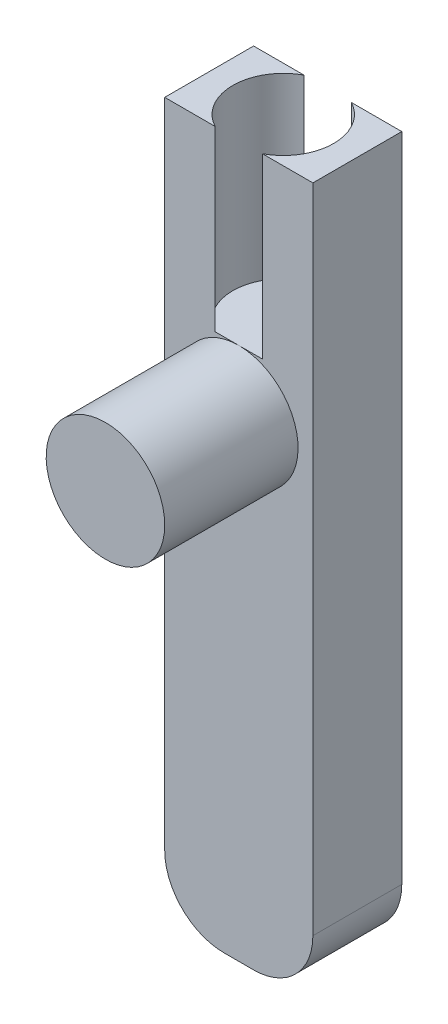
ISO-10303-21;
HEADER;
FILE_DESCRIPTION(('STEP AP214'),'2;1');
FILE_NAME('part.step','',(''),(''),'','','');
FILE_SCHEMA(('AUTOMOTIVE_DESIGN { 1 0 10303 214 1 1 1 1 }'));
ENDSEC;
DATA;
#1=APPLICATION_CONTEXT('core data for automotive mechanical design processes');
#2=APPLICATION_PROTOCOL_DEFINITION('international standard','automotive_design',2000,#1);
#3=PRODUCT_CONTEXT('',#1,'mechanical');
#4=PRODUCT('Part','Part','',(#3));
#5=PRODUCT_RELATED_PRODUCT_CATEGORY('part','',(#4));
#6=PRODUCT_DEFINITION_FORMATION('','',#4);
#7=PRODUCT_DEFINITION_CONTEXT('part definition',#1,'design');
#8=PRODUCT_DEFINITION('design','',#6,#7);
#9=PRODUCT_DEFINITION_SHAPE('','',#8);
#10=(LENGTH_UNIT() NAMED_UNIT(*) SI_UNIT(.MILLI.,.METRE.));
#11=(NAMED_UNIT(*) PLANE_ANGLE_UNIT() SI_UNIT($,.RADIAN.));
#12=(NAMED_UNIT(*) SI_UNIT($,.STERADIAN.) SOLID_ANGLE_UNIT());
#13=UNCERTAINTY_MEASURE_WITH_UNIT(LENGTH_MEASURE(1.E-05),#10,'distance_accuracy_value','');
#14=(GEOMETRIC_REPRESENTATION_CONTEXT(3) GLOBAL_UNCERTAINTY_ASSIGNED_CONTEXT((#13)) GLOBAL_UNIT_ASSIGNED_CONTEXT((#10,
#11,#12)) REPRESENTATION_CONTEXT('',''));
#15=CARTESIAN_POINT('',(0.,0.,0.));
#16=DIRECTION('',(0.,0.,1.));
#17=DIRECTION('',(1.,0.,0.));
#18=AXIS2_PLACEMENT_3D('',#15,#16,#17);
#19=CARTESIAN_POINT('',(0.,12.,1.5));
#20=DIRECTION('',(0.,-1.,0.));
#21=DIRECTION('',(0.,0.,-1.));
#22=AXIS2_PLACEMENT_3D('',#19,#20,#21);
#23=PLANE('',#22);
#24=DIRECTION('',(-1.,0.,0.));
#25=VECTOR('',#24,1.);
#26=CARTESIAN_POINT('',(0.,12.,0.));
#27=LINE('',#26,#25);
#28=CARTESIAN_POINT('',(0.,12.,0.));
#29=VERTEX_POINT('',#28);
#30=CARTESIAN_POINT('',(-0.85,12.,0.));
#31=VERTEX_POINT('',#30);
#32=EDGE_CURVE('E147',#29,#31,#27,.T.);
#33=ORIENTED_EDGE('',*,*,#32,.T.);
#34=CARTESIAN_POINT('',(-1.25,12.,0.75));
#35=DIRECTION('',(0.,1.,0.));
#36=DIRECTION('',(0.,0.,1.));
#37=AXIS2_PLACEMENT_3D('',#34,#35,#36);
#38=CIRCLE('',#37,0.85);
#39=CARTESIAN_POINT('',(-0.85,12.,1.5));
#40=VERTEX_POINT('',#39);
#41=EDGE_CURVE('E168',#40,#31,#38,.T.);
#42=ORIENTED_EDGE('',*,*,#41,.F.);
#43=DIRECTION('',(-1.,0.,0.));
#44=VECTOR('',#43,1.);
#45=CARTESIAN_POINT('',(0.,12.,1.5));
#46=LINE('',#45,#44);
#47=CARTESIAN_POINT('',(0.,12.,1.5));
#48=VERTEX_POINT('',#47);
#49=EDGE_CURVE('E131',#48,#40,#46,.T.);
#50=ORIENTED_EDGE('',*,*,#49,.F.);
#51=DIRECTION('',(0.,0.,-1.));
#52=VECTOR('',#51,1.);
#53=CARTESIAN_POINT('',(0.,12.,1.5));
#54=LINE('',#53,#52);
#55=EDGE_CURVE('E125',#48,#29,#54,.T.);
#56=ORIENTED_EDGE('',*,*,#55,.T.);
#57=EDGE_LOOP('',(#33,#42,#50,#56));
#58=FACE_BOUND('',#57,.T.);
#59=ADVANCED_FACE('F34',(#58),#23,.F.);
#60=CARTESIAN_POINT('',(-2.5,1.00000000000001,1.5));
#61=DIRECTION('',(1.,0.,0.));
#62=DIRECTION('',(0.,1.,0.));
#63=AXIS2_PLACEMENT_3D('',#60,#61,#62);
#64=PLANE('',#63);
#65=DIRECTION('',(0.,-1.,0.));
#66=VECTOR('',#65,1.);
#67=CARTESIAN_POINT('',(-2.5,1.00000000000001,0.));
#68=LINE('',#67,#66);
#69=CARTESIAN_POINT('',(-2.5,12.,0.));
#70=VERTEX_POINT('',#69);
#71=CARTESIAN_POINT('',(-2.5,1.,0.));
#72=VERTEX_POINT('',#71);
#73=EDGE_CURVE('E136',#70,#72,#68,.T.);
#74=ORIENTED_EDGE('',*,*,#73,.T.);
#75=DIRECTION('',(0.,0.,-1.));
#76=VECTOR('',#75,1.);
#77=CARTESIAN_POINT('',(-2.5,1.,1.5));
#78=LINE('',#77,#76);
#79=CARTESIAN_POINT('',(-2.5,1.,1.5));
#80=VERTEX_POINT('',#79);
#81=EDGE_CURVE('E11',#80,#72,#78,.T.);
#82=ORIENTED_EDGE('',*,*,#81,.F.);
#83=DIRECTION('',(0.,-1.,0.));
#84=VECTOR('',#83,1.);
#85=CARTESIAN_POINT('',(-2.5,1.00000000000001,1.5));
#86=LINE('',#85,#84);
#87=CARTESIAN_POINT('',(-2.5,12.,1.5));
#88=VERTEX_POINT('',#87);
#89=EDGE_CURVE('E150',#88,#80,#86,.T.);
#90=ORIENTED_EDGE('',*,*,#89,.F.);
#91=DIRECTION('',(0.,0.,-1.));
#92=VECTOR('',#91,1.);
#93=CARTESIAN_POINT('',(-2.5,12.,1.5));
#94=LINE('',#93,#92);
#95=EDGE_CURVE('E135',#88,#70,#94,.T.);
#96=ORIENTED_EDGE('',*,*,#95,.T.);
#97=EDGE_LOOP('',(#74,#82,#90,#96));
#98=FACE_BOUND('',#97,.T.);
#99=ADVANCED_FACE('F36',(#98),#64,.F.);
#100=CARTESIAN_POINT('',(-1.5,1.,1.5));
#101=DIRECTION('',(0.,0.,-1.));
#102=DIRECTION('',(-1.,0.,0.));
#103=AXIS2_PLACEMENT_3D('',#100,#101,#102);
#104=CYLINDRICAL_SURFACE('',#103,1.);
#105=CARTESIAN_POINT('',(-1.5,1.,0.));
#106=DIRECTION('',(0.,0.,1.));
#107=DIRECTION('',(-1.,0.,0.));
#108=AXIS2_PLACEMENT_3D('',#105,#106,#107);
#109=CIRCLE('',#108,1.);
#110=CARTESIAN_POINT('',(-1.49999999999999,0.,0.));
#111=VERTEX_POINT('',#110);
#112=EDGE_CURVE('E139',#72,#111,#109,.T.);
#113=ORIENTED_EDGE('',*,*,#112,.T.);
#114=DIRECTION('',(0.,0.,-1.));
#115=VECTOR('',#114,1.);
#116=CARTESIAN_POINT('',(-1.49999999999999,0.,1.5));
#117=LINE('',#116,#115);
#118=CARTESIAN_POINT('',(-1.49999999999999,0.,1.5));
#119=VERTEX_POINT('',#118);
#120=EDGE_CURVE('E42',#119,#111,#117,.T.);
#121=ORIENTED_EDGE('',*,*,#120,.F.);
#122=CARTESIAN_POINT('',(-1.5,1.,1.5));
#123=DIRECTION('',(0.,0.,1.));
#124=DIRECTION('',(-1.,0.,0.));
#125=AXIS2_PLACEMENT_3D('',#122,#123,#124);
#126=CIRCLE('',#125,1.);
#127=EDGE_CURVE('E94',#80,#119,#126,.T.);
#128=ORIENTED_EDGE('',*,*,#127,.F.);
#129=ORIENTED_EDGE('',*,*,#81,.T.);
#130=EDGE_LOOP('',(#113,#121,#128,#129));
#131=FACE_BOUND('',#130,.T.);
#132=ADVANCED_FACE('F243',(#131),#104,.T.);
#133=CARTESIAN_POINT('',(-1.00000000000001,0.,1.5));
#134=DIRECTION('',(0.,1.,0.));
#135=DIRECTION('',(-1.,0.,0.));
#136=AXIS2_PLACEMENT_3D('',#133,#134,#135);
#137=PLANE('',#136);
#138=DIRECTION('',(1.,0.,0.));
#139=VECTOR('',#138,1.);
#140=CARTESIAN_POINT('',(-1.00000000000001,0.,0.));
#141=LINE('',#140,#139);
#142=CARTESIAN_POINT('',(-1.00000000000001,0.,0.));
#143=VERTEX_POINT('',#142);
#144=EDGE_CURVE('E142',#111,#143,#141,.T.);
#145=ORIENTED_EDGE('',*,*,#144,.T.);
#146=DIRECTION('',(0.,0.,-1.));
#147=VECTOR('',#146,1.);
#148=CARTESIAN_POINT('',(-1.00000000000001,0.,1.5));
#149=LINE('',#148,#147);
#150=CARTESIAN_POINT('',(-1.00000000000001,0.,1.5));
#151=VERTEX_POINT('',#150);
#152=EDGE_CURVE('E124',#151,#143,#149,.T.);
#153=ORIENTED_EDGE('',*,*,#152,.F.);
#154=DIRECTION('',(1.,0.,0.));
#155=VECTOR('',#154,1.);
#156=CARTESIAN_POINT('',(-1.00000000000001,0.,1.5));
#157=LINE('',#156,#155);
#158=EDGE_CURVE('E112',#119,#151,#157,.T.);
#159=ORIENTED_EDGE('',*,*,#158,.F.);
#160=ORIENTED_EDGE('',*,*,#120,.T.);
#161=EDGE_LOOP('',(#145,#153,#159,#160));
#162=FACE_BOUND('',#161,.T.);
#163=ADVANCED_FACE('F156',(#162),#137,.F.);
#164=CARTESIAN_POINT('',(-1.,1.,1.5));
#165=DIRECTION('',(0.,0.,-1.));
#166=DIRECTION('',(-1.,0.,0.));
#167=AXIS2_PLACEMENT_3D('',#164,#165,#166);
#168=CYLINDRICAL_SURFACE('',#167,1.);
#169=CARTESIAN_POINT('',(-1.,1.,0.));
#170=DIRECTION('',(0.,0.,1.));
#171=DIRECTION('',(1.,0.,0.));
#172=AXIS2_PLACEMENT_3D('',#169,#170,#171);
#173=CIRCLE('',#172,1.);
#174=CARTESIAN_POINT('',(0.,1.00000000000001,0.));
#175=VERTEX_POINT('',#174);
#176=EDGE_CURVE('E121',#143,#175,#173,.T.);
#177=ORIENTED_EDGE('',*,*,#176,.T.);
#178=DIRECTION('',(0.,0.,-1.));
#179=VECTOR('',#178,1.);
#180=CARTESIAN_POINT('',(0.,1.00000000000001,1.5));
#181=LINE('',#180,#179);
#182=CARTESIAN_POINT('',(0.,1.00000000000001,1.5));
#183=VERTEX_POINT('',#182);
#184=EDGE_CURVE('E118',#183,#175,#181,.T.);
#185=ORIENTED_EDGE('',*,*,#184,.F.);
#186=CARTESIAN_POINT('',(-1.,1.,1.5));
#187=DIRECTION('',(0.,0.,1.));
#188=DIRECTION('',(1.,0.,0.));
#189=AXIS2_PLACEMENT_3D('',#186,#187,#188);
#190=CIRCLE('',#189,1.);
#191=EDGE_CURVE('E103',#151,#183,#190,.T.);
#192=ORIENTED_EDGE('',*,*,#191,.F.);
#193=ORIENTED_EDGE('',*,*,#152,.T.);
#194=EDGE_LOOP('',(#177,#185,#192,#193));
#195=FACE_BOUND('',#194,.T.);
#196=ADVANCED_FACE('F119',(#195),#168,.T.);
#197=CARTESIAN_POINT('',(0.,1.00000000000001,1.5));
#198=DIRECTION('',(-1.,0.,0.));
#199=DIRECTION('',(0.,0.,1.));
#200=AXIS2_PLACEMENT_3D('',#197,#198,#199);
#201=PLANE('',#200);
#202=DIRECTION('',(0.,1.,0.));
#203=VECTOR('',#202,1.);
#204=CARTESIAN_POINT('',(0.,1.00000000000001,0.));
#205=LINE('',#204,#203);
#206=EDGE_CURVE('E145',#175,#29,#205,.T.);
#207=ORIENTED_EDGE('',*,*,#206,.T.);
#208=ORIENTED_EDGE('',*,*,#55,.F.);
#209=DIRECTION('',(0.,1.,0.));
#210=VECTOR('',#209,1.);
#211=CARTESIAN_POINT('',(0.,1.00000000000001,1.5));
#212=LINE('',#211,#210);
#213=EDGE_CURVE('E109',#183,#48,#212,.T.);
#214=ORIENTED_EDGE('',*,*,#213,.F.);
#215=ORIENTED_EDGE('',*,*,#184,.T.);
#216=EDGE_LOOP('',(#207,#208,#214,#215));
#217=FACE_BOUND('',#216,.T.);
#218=ADVANCED_FACE('F127',(#217),#201,.F.);
#219=CARTESIAN_POINT('',(-1.65,12.,1.5));
#220=VERTEX_POINT('',#219);
#221=EDGE_CURVE('E58',#220,#88,#46,.T.);
#222=ORIENTED_EDGE('',*,*,#221,.F.);
#223=CARTESIAN_POINT('',(-1.65,12.,0.));
#224=VERTEX_POINT('',#223);
#225=EDGE_CURVE('E189',#224,#220,#38,.T.);
#226=ORIENTED_EDGE('',*,*,#225,.F.);
#227=EDGE_CURVE('E86',#224,#70,#27,.T.);
#228=ORIENTED_EDGE('',*,*,#227,.T.);
#229=ORIENTED_EDGE('',*,*,#95,.F.);
#230=EDGE_LOOP('',(#222,#226,#228,#229));
#231=FACE_BOUND('',#230,.T.);
#232=ADVANCED_FACE('F199',(#231),#23,.F.);
#233=CARTESIAN_POINT('',(-1.,1.,1.5));
#234=DIRECTION('',(0.,0.,1.));
#235=DIRECTION('',(1.,0.,0.));
#236=AXIS2_PLACEMENT_3D('',#233,#234,#235);
#237=PLANE('',#236);
#238=DIRECTION('',(0.,1.,0.));
#239=VECTOR('',#238,1.);
#240=CARTESIAN_POINT('',(-0.85,9.,1.5));
#241=LINE('',#240,#239);
#242=CARTESIAN_POINT('',(-0.85,9.,1.5));
#243=VERTEX_POINT('',#242);
#244=EDGE_CURVE('E172',#243,#40,#241,.T.);
#245=ORIENTED_EDGE('',*,*,#244,.F.);
#246=DIRECTION('',(-1.,0.,0.));
#247=VECTOR('',#246,1.);
#248=CARTESIAN_POINT('',(-1.,9.,1.5));
#249=LINE('',#248,#247);
#250=CARTESIAN_POINT('',(-1.25,9.,1.5));
#251=VERTEX_POINT('',#250);
#252=EDGE_CURVE('E214',#243,#251,#249,.T.);
#253=ORIENTED_EDGE('',*,*,#252,.T.);
#254=CARTESIAN_POINT('',(-1.25,8.,1.5));
#255=DIRECTION('',(0.,0.,1.));
#256=DIRECTION('',(1.,0.,0.));
#257=AXIS2_PLACEMENT_3D('',#254,#255,#256);
#258=CIRCLE('',#257,1.);
#259=EDGE_CURVE('E206',#251,#251,#258,.T.);
#260=ORIENTED_EDGE('',*,*,#259,.F.);
#261=CARTESIAN_POINT('',(-1.65,9.,1.5));
#262=VERTEX_POINT('',#261);
#263=EDGE_CURVE('E196',#251,#262,#249,.T.);
#264=ORIENTED_EDGE('',*,*,#263,.T.);
#265=DIRECTION('',(0.,1.,0.));
#266=VECTOR('',#265,1.);
#267=CARTESIAN_POINT('',(-1.65,9.,1.5));
#268=LINE('',#267,#266);
#269=EDGE_CURVE('E191',#220,#262,#268,.F.);
#270=ORIENTED_EDGE('',*,*,#269,.F.);
#271=ORIENTED_EDGE('',*,*,#221,.T.);
#272=ORIENTED_EDGE('',*,*,#89,.T.);
#273=ORIENTED_EDGE('',*,*,#127,.T.);
#274=ORIENTED_EDGE('',*,*,#158,.T.);
#275=ORIENTED_EDGE('',*,*,#191,.T.);
#276=ORIENTED_EDGE('',*,*,#213,.T.);
#277=ORIENTED_EDGE('',*,*,#49,.T.);
#278=EDGE_LOOP('',(#245,#253,#260,#264,#270,#271,#272,#273,#274,#275,#276,#277));
#279=FACE_BOUND('',#278,.T.);
#280=ADVANCED_FACE('F106',(#279),#237,.T.);
#281=CARTESIAN_POINT('',(-1.,1.,0.));
#282=DIRECTION('',(0.,0.,1.));
#283=DIRECTION('',(1.,0.,0.));
#284=AXIS2_PLACEMENT_3D('',#281,#282,#283);
#285=PLANE('',#284);
#286=DIRECTION('',(-1.,0.,0.));
#287=VECTOR('',#286,1.);
#288=CARTESIAN_POINT('',(-1.,9.,0.));
#289=LINE('',#288,#287);
#290=CARTESIAN_POINT('',(-0.85,9.,0.));
#291=VERTEX_POINT('',#290);
#292=CARTESIAN_POINT('',(-1.65,9.,0.));
#293=VERTEX_POINT('',#292);
#294=EDGE_CURVE('E215',#291,#293,#289,.T.);
#295=ORIENTED_EDGE('',*,*,#294,.F.);
#296=DIRECTION('',(0.,1.,0.));
#297=VECTOR('',#296,1.);
#298=CARTESIAN_POINT('',(-0.85,9.,0.));
#299=LINE('',#298,#297);
#300=EDGE_CURVE('E197',#291,#31,#299,.T.);
#301=ORIENTED_EDGE('',*,*,#300,.T.);
#302=ORIENTED_EDGE('',*,*,#32,.F.);
#303=ORIENTED_EDGE('',*,*,#206,.F.);
#304=ORIENTED_EDGE('',*,*,#176,.F.);
#305=ORIENTED_EDGE('',*,*,#144,.F.);
#306=ORIENTED_EDGE('',*,*,#112,.F.);
#307=ORIENTED_EDGE('',*,*,#73,.F.);
#308=ORIENTED_EDGE('',*,*,#227,.F.);
#309=DIRECTION('',(0.,1.,0.));
#310=VECTOR('',#309,1.);
#311=CARTESIAN_POINT('',(-1.65,9.,0.));
#312=LINE('',#311,#310);
#313=EDGE_CURVE('E187',#224,#293,#312,.F.);
#314=ORIENTED_EDGE('',*,*,#313,.T.);
#315=EDGE_LOOP('',(#295,#301,#302,#303,#304,#305,#306,#307,#308,#314));
#316=FACE_BOUND('',#315,.T.);
#317=ADVANCED_FACE('F159',(#316),#285,.F.);
#318=CARTESIAN_POINT('',(-1.25,8.,3.75));
#319=DIRECTION('',(0.,0.,-1.));
#320=DIRECTION('',(-1.,0.,0.));
#321=AXIS2_PLACEMENT_3D('',#318,#319,#320);
#322=CYLINDRICAL_SURFACE('',#321,1.);
#323=ORIENTED_EDGE('',*,*,#259,.T.);
#324=EDGE_LOOP('',(#323));
#325=FACE_BOUND('',#324,.T.);
#326=CARTESIAN_POINT('',(-1.25,8.,3.75));
#327=DIRECTION('',(0.,0.,1.));
#328=DIRECTION('',(1.,0.,0.));
#329=AXIS2_PLACEMENT_3D('',#326,#327,#328);
#330=CIRCLE('',#329,1.);
#331=CARTESIAN_POINT('',(-0.249999999999999,8.,3.75));
#332=VERTEX_POINT('',#331);
#333=EDGE_CURVE('E140',#332,#332,#330,.T.);
#334=ORIENTED_EDGE('',*,*,#333,.F.);
#335=EDGE_LOOP('',(#334));
#336=FACE_BOUND('',#335,.T.);
#337=ADVANCED_FACE('F225',(#325,#336),#322,.T.);
#338=CARTESIAN_POINT('',(-1.25,8.,3.75));
#339=DIRECTION('',(0.,0.,1.));
#340=DIRECTION('',(1.,0.,0.));
#341=AXIS2_PLACEMENT_3D('',#338,#339,#340);
#342=PLANE('',#341);
#343=ORIENTED_EDGE('',*,*,#333,.T.);
#344=EDGE_LOOP('',(#343));
#345=FACE_BOUND('',#344,.T.);
#346=ADVANCED_FACE('F228',(#345),#342,.T.);
#347=CARTESIAN_POINT('',(-1.25,9.,0.75));
#348=DIRECTION('',(0.,1.,0.));
#349=DIRECTION('',(0.,0.,1.));
#350=AXIS2_PLACEMENT_3D('',#347,#348,#349);
#351=CYLINDRICAL_SURFACE('',#350,0.85);
#352=ORIENTED_EDGE('',*,*,#244,.T.);
#353=ORIENTED_EDGE('',*,*,#41,.T.);
#354=ORIENTED_EDGE('',*,*,#300,.F.);
#355=CARTESIAN_POINT('',(-1.25,9.,0.75));
#356=DIRECTION('',(0.,1.,0.));
#357=DIRECTION('',(0.,0.,1.));
#358=AXIS2_PLACEMENT_3D('',#355,#356,#357);
#359=CIRCLE('',#358,0.85);
#360=EDGE_CURVE('E49',#243,#291,#359,.T.);
#361=ORIENTED_EDGE('',*,*,#360,.F.);
#362=EDGE_LOOP('',(#352,#353,#354,#361));
#363=FACE_BOUND('',#362,.T.);
#364=ADVANCED_FACE('F222',(#363),#351,.F.);
#365=ORIENTED_EDGE('',*,*,#269,.T.);
#366=EDGE_CURVE('E218',#293,#262,#359,.T.);
#367=ORIENTED_EDGE('',*,*,#366,.F.);
#368=ORIENTED_EDGE('',*,*,#313,.F.);
#369=ORIENTED_EDGE('',*,*,#225,.T.);
#370=EDGE_LOOP('',(#365,#367,#368,#369));
#371=FACE_BOUND('',#370,.T.);
#372=ADVANCED_FACE('F190',(#371),#351,.F.);
#373=CARTESIAN_POINT('',(-1.25,9.,0.75));
#374=DIRECTION('',(0.,1.,0.));
#375=DIRECTION('',(0.,0.,1.));
#376=AXIS2_PLACEMENT_3D('',#373,#374,#375);
#377=PLANE('',#376);
#378=ORIENTED_EDGE('',*,*,#360,.T.);
#379=ORIENTED_EDGE('',*,*,#294,.T.);
#380=ORIENTED_EDGE('',*,*,#366,.T.);
#381=ORIENTED_EDGE('',*,*,#263,.F.);
#382=ORIENTED_EDGE('',*,*,#252,.F.);
#383=EDGE_LOOP('',(#378,#379,#380,#381,#382));
#384=FACE_BOUND('',#383,.T.);
#385=ADVANCED_FACE('F219',(#384),#377,.T.);
#386=CLOSED_SHELL('',(#59,#99,#132,#163,#196,#218,#232,#280,#317,#337,#346,#364,#372,#385));
#387=MANIFOLD_SOLID_BREP('B2',#386);
#388=ADVANCED_BREP_SHAPE_REPRESENTATION('',(#18,#387),#14);
#389=SHAPE_DEFINITION_REPRESENTATION(#9,#388);
ENDSEC;
END-ISO-10303-21;
